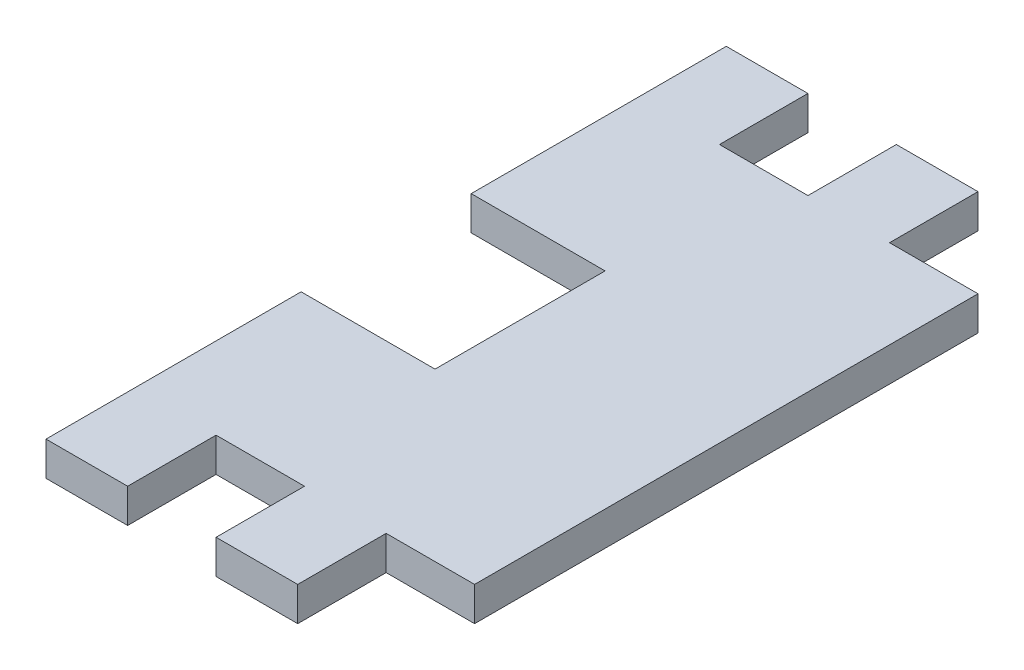
ISO-10303-21;
HEADER;
FILE_DESCRIPTION(('STEP AP214'),'2;1');
FILE_NAME('part.step','',(''),(''),'','','');
FILE_SCHEMA(('AUTOMOTIVE_DESIGN { 1 0 10303 214 1 1 1 1 }'));
ENDSEC;
DATA;
#1=APPLICATION_CONTEXT('core data for automotive mechanical design processes');
#2=APPLICATION_PROTOCOL_DEFINITION('international standard','automotive_design',2000,#1);
#3=PRODUCT_CONTEXT('',#1,'mechanical');
#4=PRODUCT('Part','Part','',(#3));
#5=PRODUCT_RELATED_PRODUCT_CATEGORY('part','',(#4));
#6=PRODUCT_DEFINITION_FORMATION('','',#4);
#7=PRODUCT_DEFINITION_CONTEXT('part definition',#1,'design');
#8=PRODUCT_DEFINITION('design','',#6,#7);
#9=PRODUCT_DEFINITION_SHAPE('','',#8);
#10=(LENGTH_UNIT() NAMED_UNIT(*) SI_UNIT(.MILLI.,.METRE.));
#11=(NAMED_UNIT(*) PLANE_ANGLE_UNIT() SI_UNIT($,.RADIAN.));
#12=(NAMED_UNIT(*) SI_UNIT($,.STERADIAN.) SOLID_ANGLE_UNIT());
#13=UNCERTAINTY_MEASURE_WITH_UNIT(LENGTH_MEASURE(1.E-05),#10,'distance_accuracy_value','');
#14=(GEOMETRIC_REPRESENTATION_CONTEXT(3) GLOBAL_UNCERTAINTY_ASSIGNED_CONTEXT((#13)) GLOBAL_UNIT_ASSIGNED_CONTEXT((#10,
#11,#12)) REPRESENTATION_CONTEXT('',''));
#15=CARTESIAN_POINT('',(0.,0.,0.));
#16=DIRECTION('',(0.,0.,1.));
#17=DIRECTION('',(1.,0.,0.));
#18=AXIS2_PLACEMENT_3D('',#15,#16,#17);
#19=CARTESIAN_POINT('',(0.,1.27,25.4));
#20=DIRECTION('',(0.,0.,-1.));
#21=DIRECTION('',(-1.,0.,0.));
#22=AXIS2_PLACEMENT_3D('',#19,#20,#21);
#23=PLANE('',#22);
#24=DIRECTION('',(1.,0.,0.));
#25=VECTOR('',#24,1.);
#26=CARTESIAN_POINT('',(0.,-1.27,25.4));
#27=LINE('',#26,#25);
#28=CARTESIAN_POINT('',(-25.4,-1.27,25.4));
#29=VERTEX_POINT('',#28);
#30=CARTESIAN_POINT('',(-19.304,-1.27,25.3999999999999));
#31=VERTEX_POINT('',#30);
#32=EDGE_CURVE('E234',#29,#31,#27,.T.);
#33=ORIENTED_EDGE('',*,*,#32,.T.);
#34=DIRECTION('',(0.,1.,0.));
#35=VECTOR('',#34,1.);
#36=CARTESIAN_POINT('',(-19.304,-1.27,25.3999999999999));
#37=LINE('',#36,#35);
#38=CARTESIAN_POINT('',(-19.304,1.27,25.3999999999999));
#39=VERTEX_POINT('',#38);
#40=EDGE_CURVE('E316',#31,#39,#37,.T.);
#41=ORIENTED_EDGE('',*,*,#40,.T.);
#42=DIRECTION('',(1.,0.,0.));
#43=VECTOR('',#42,1.);
#44=CARTESIAN_POINT('',(0.,1.27,25.4));
#45=LINE('',#44,#43);
#46=CARTESIAN_POINT('',(-25.4,1.27,25.4));
#47=VERTEX_POINT('',#46);
#48=EDGE_CURVE('E279',#47,#39,#45,.T.);
#49=ORIENTED_EDGE('',*,*,#48,.F.);
#50=DIRECTION('',(0.,-1.,0.));
#51=VECTOR('',#50,1.);
#52=CARTESIAN_POINT('',(-25.4,1.27,25.4));
#53=LINE('',#52,#51);
#54=EDGE_CURVE('E217',#47,#29,#53,.T.);
#55=ORIENTED_EDGE('',*,*,#54,.T.);
#56=EDGE_LOOP('',(#33,#41,#49,#55));
#57=FACE_BOUND('',#56,.T.);
#58=ADVANCED_FACE('F32',(#57),#23,.F.);
#59=CARTESIAN_POINT('',(0.,1.27,-25.4));
#60=DIRECTION('',(0.,0.,1.));
#61=DIRECTION('',(1.,0.,0.));
#62=AXIS2_PLACEMENT_3D('',#59,#60,#61);
#63=PLANE('',#62);
#64=DIRECTION('',(-1.,0.,0.));
#65=VECTOR('',#64,1.);
#66=CARTESIAN_POINT('',(0.,-1.27,-25.4));
#67=LINE('',#66,#65);
#68=CARTESIAN_POINT('',(-6.604,-1.27,-25.4));
#69=VERTEX_POINT('',#68);
#70=CARTESIAN_POINT('',(-12.7,-1.27,-25.3999999999999));
#71=VERTEX_POINT('',#70);
#72=EDGE_CURVE('E188',#69,#71,#67,.T.);
#73=ORIENTED_EDGE('',*,*,#72,.T.);
#74=DIRECTION('',(0.,1.,0.));
#75=VECTOR('',#74,1.);
#76=CARTESIAN_POINT('',(-12.7,-1.27,-25.3999999999999));
#77=LINE('',#76,#75);
#78=CARTESIAN_POINT('',(-12.7,1.27,-25.3999999999999));
#79=VERTEX_POINT('',#78);
#80=EDGE_CURVE('E169',#71,#79,#77,.T.);
#81=ORIENTED_EDGE('',*,*,#80,.T.);
#82=DIRECTION('',(-1.,0.,0.));
#83=VECTOR('',#82,1.);
#84=CARTESIAN_POINT('',(0.,1.27,-25.4));
#85=LINE('',#84,#83);
#86=CARTESIAN_POINT('',(-6.604,1.27,-25.4));
#87=VERTEX_POINT('',#86);
#88=EDGE_CURVE('E286',#87,#79,#85,.T.);
#89=ORIENTED_EDGE('',*,*,#88,.F.);
#90=DIRECTION('',(0.,1.,0.));
#91=VECTOR('',#90,1.);
#92=CARTESIAN_POINT('',(-6.604,-1.27,-25.4));
#93=LINE('',#92,#91);
#94=EDGE_CURVE('E195',#69,#87,#93,.T.);
#95=ORIENTED_EDGE('',*,*,#94,.F.);
#96=EDGE_LOOP('',(#73,#81,#89,#95));
#97=FACE_BOUND('',#96,.T.);
#98=ADVANCED_FACE('F194',(#97),#63,.F.);
#99=CARTESIAN_POINT('',(-15.4,1.27,-6.35));
#100=DIRECTION('',(1.,0.,0.));
#101=DIRECTION('',(0.,0.,-1.));
#102=AXIS2_PLACEMENT_3D('',#99,#100,#101);
#103=PLANE('',#102);
#104=DIRECTION('',(0.,0.,1.));
#105=VECTOR('',#104,1.);
#106=CARTESIAN_POINT('',(-15.4,-1.27,-6.35));
#107=LINE('',#106,#105);
#108=CARTESIAN_POINT('',(-15.4,-1.27,-6.35));
#109=VERTEX_POINT('',#108);
#110=CARTESIAN_POINT('',(-15.4,-1.27,6.35));
#111=VERTEX_POINT('',#110);
#112=EDGE_CURVE('E238',#109,#111,#107,.T.);
#113=ORIENTED_EDGE('',*,*,#112,.T.);
#114=DIRECTION('',(0.,-1.,0.));
#115=VECTOR('',#114,1.);
#116=CARTESIAN_POINT('',(-15.4,1.27,6.35));
#117=LINE('',#116,#115);
#118=CARTESIAN_POINT('',(-15.4,1.27,6.35));
#119=VERTEX_POINT('',#118);
#120=EDGE_CURVE('E11',#119,#111,#117,.T.);
#121=ORIENTED_EDGE('',*,*,#120,.F.);
#122=DIRECTION('',(0.,0.,1.));
#123=VECTOR('',#122,1.);
#124=CARTESIAN_POINT('',(-15.4,1.27,-6.35));
#125=LINE('',#124,#123);
#126=CARTESIAN_POINT('',(-15.4,1.27,-6.35));
#127=VERTEX_POINT('',#126);
#128=EDGE_CURVE('E206',#127,#119,#125,.T.);
#129=ORIENTED_EDGE('',*,*,#128,.F.);
#130=DIRECTION('',(0.,-1.,0.));
#131=VECTOR('',#130,1.);
#132=CARTESIAN_POINT('',(-15.4,1.27,-6.35));
#133=LINE('',#132,#131);
#134=EDGE_CURVE('E207',#127,#109,#133,.T.);
#135=ORIENTED_EDGE('',*,*,#134,.T.);
#136=EDGE_LOOP('',(#113,#121,#129,#135));
#137=FACE_BOUND('',#136,.T.);
#138=ADVANCED_FACE('F34',(#137),#103,.F.);
#139=CARTESIAN_POINT('',(-25.4,1.27,6.35));
#140=DIRECTION('',(0.,0.,1.));
#141=DIRECTION('',(1.,0.,0.));
#142=AXIS2_PLACEMENT_3D('',#139,#140,#141);
#143=PLANE('',#142);
#144=DIRECTION('',(-1.,0.,0.));
#145=VECTOR('',#144,1.);
#146=CARTESIAN_POINT('',(-25.4,-1.27,6.35));
#147=LINE('',#146,#145);
#148=CARTESIAN_POINT('',(-25.4,-1.27,6.35));
#149=VERTEX_POINT('',#148);
#150=EDGE_CURVE('E231',#111,#149,#147,.T.);
#151=ORIENTED_EDGE('',*,*,#150,.T.);
#152=DIRECTION('',(0.,-1.,0.));
#153=VECTOR('',#152,1.);
#154=CARTESIAN_POINT('',(-25.4,1.27,6.35));
#155=LINE('',#154,#153);
#156=CARTESIAN_POINT('',(-25.4,1.27,6.35));
#157=VERTEX_POINT('',#156);
#158=EDGE_CURVE('E40',#157,#149,#155,.T.);
#159=ORIENTED_EDGE('',*,*,#158,.F.);
#160=DIRECTION('',(-1.,0.,0.));
#161=VECTOR('',#160,1.);
#162=CARTESIAN_POINT('',(-25.4,1.27,6.35));
#163=LINE('',#162,#161);
#164=EDGE_CURVE('E275',#119,#157,#163,.T.);
#165=ORIENTED_EDGE('',*,*,#164,.F.);
#166=ORIENTED_EDGE('',*,*,#120,.T.);
#167=EDGE_LOOP('',(#151,#159,#165,#166));
#168=FACE_BOUND('',#167,.T.);
#169=ADVANCED_FACE('F394',(#168),#143,.F.);
#170=CARTESIAN_POINT('',(-25.4,1.27,25.4));
#171=DIRECTION('',(1.,0.,0.));
#172=DIRECTION('',(0.,0.,-1.));
#173=AXIS2_PLACEMENT_3D('',#170,#171,#172);
#174=PLANE('',#173);
#175=DIRECTION('',(0.,0.,1.));
#176=VECTOR('',#175,1.);
#177=CARTESIAN_POINT('',(-25.4,-1.27,25.4));
#178=LINE('',#177,#176);
#179=EDGE_CURVE('E226',#149,#29,#178,.T.);
#180=ORIENTED_EDGE('',*,*,#179,.T.);
#181=ORIENTED_EDGE('',*,*,#54,.F.);
#182=DIRECTION('',(0.,0.,1.));
#183=VECTOR('',#182,1.);
#184=CARTESIAN_POINT('',(-25.4,1.27,25.4));
#185=LINE('',#184,#183);
#186=EDGE_CURVE('E227',#157,#47,#185,.T.);
#187=ORIENTED_EDGE('',*,*,#186,.F.);
#188=ORIENTED_EDGE('',*,*,#158,.T.);
#189=EDGE_LOOP('',(#180,#181,#187,#188));
#190=FACE_BOUND('',#189,.T.);
#191=ADVANCED_FACE('F224',(#190),#174,.F.);
#192=CARTESIAN_POINT('',(-12.7,-1.27,25.3999999999999));
#193=VERTEX_POINT('',#192);
#194=CARTESIAN_POINT('',(-6.60400000000001,-1.27,25.4));
#195=VERTEX_POINT('',#194);
#196=EDGE_CURVE('E235',#193,#195,#27,.T.);
#197=ORIENTED_EDGE('',*,*,#196,.T.);
#198=DIRECTION('',(0.,1.,0.));
#199=VECTOR('',#198,1.);
#200=CARTESIAN_POINT('',(-6.60400000000001,-1.27,25.4));
#201=LINE('',#200,#199);
#202=CARTESIAN_POINT('',(-6.60400000000001,1.27,25.4));
#203=VERTEX_POINT('',#202);
#204=EDGE_CURVE('E337',#195,#203,#201,.T.);
#205=ORIENTED_EDGE('',*,*,#204,.T.);
#206=CARTESIAN_POINT('',(-12.7,1.27,25.3999999999999));
#207=VERTEX_POINT('',#206);
#208=EDGE_CURVE('E278',#207,#203,#45,.T.);
#209=ORIENTED_EDGE('',*,*,#208,.F.);
#210=DIRECTION('',(0.,1.,0.));
#211=VECTOR('',#210,1.);
#212=CARTESIAN_POINT('',(-12.7,-1.27,25.3999999999999));
#213=LINE('',#212,#211);
#214=EDGE_CURVE('E332',#193,#207,#213,.T.);
#215=ORIENTED_EDGE('',*,*,#214,.F.);
#216=EDGE_LOOP('',(#197,#205,#209,#215));
#217=FACE_BOUND('',#216,.T.);
#218=ADVANCED_FACE('F369',(#217),#23,.F.);
#219=CARTESIAN_POINT('',(0.,1.27,25.4));
#220=DIRECTION('',(-1.,0.,0.));
#221=DIRECTION('',(0.,0.,1.));
#222=AXIS2_PLACEMENT_3D('',#219,#220,#221);
#223=PLANE('',#222);
#224=DIRECTION('',(0.,0.,-1.));
#225=VECTOR('',#224,1.);
#226=CARTESIAN_POINT('',(0.,1.27,25.4));
#227=LINE('',#226,#225);
#228=CARTESIAN_POINT('',(0.,1.27,18.796));
#229=VERTEX_POINT('',#228);
#230=CARTESIAN_POINT('',(0.,1.27,-18.796));
#231=VERTEX_POINT('',#230);
#232=EDGE_CURVE('E282',#229,#231,#227,.T.);
#233=ORIENTED_EDGE('',*,*,#232,.F.);
#234=DIRECTION('',(0.,1.,0.));
#235=VECTOR('',#234,1.);
#236=CARTESIAN_POINT('',(0.,-1.27,18.796));
#237=LINE('',#236,#235);
#238=CARTESIAN_POINT('',(0.,-1.27,18.796));
#239=VERTEX_POINT('',#238);
#240=EDGE_CURVE('E252',#239,#229,#237,.T.);
#241=ORIENTED_EDGE('',*,*,#240,.F.);
#242=DIRECTION('',(0.,0.,-1.));
#243=VECTOR('',#242,1.);
#244=CARTESIAN_POINT('',(0.,-1.27,25.4));
#245=LINE('',#244,#243);
#246=CARTESIAN_POINT('',(0.,-1.27,-18.796));
#247=VERTEX_POINT('',#246);
#248=EDGE_CURVE('E201',#239,#247,#245,.T.);
#249=ORIENTED_EDGE('',*,*,#248,.T.);
#250=DIRECTION('',(0.,1.,0.));
#251=VECTOR('',#250,1.);
#252=CARTESIAN_POINT('',(0.,-1.27,-18.796));
#253=LINE('',#252,#251);
#254=EDGE_CURVE('E250',#247,#231,#253,.T.);
#255=ORIENTED_EDGE('',*,*,#254,.T.);
#256=EDGE_LOOP('',(#233,#241,#249,#255));
#257=FACE_BOUND('',#256,.T.);
#258=ADVANCED_FACE('F249',(#257),#223,.F.);
#259=CARTESIAN_POINT('',(-19.304,1.27,-25.3999999999999));
#260=VERTEX_POINT('',#259);
#261=CARTESIAN_POINT('',(-25.4,1.27,-25.4));
#262=VERTEX_POINT('',#261);
#263=EDGE_CURVE('E284',#260,#262,#85,.T.);
#264=ORIENTED_EDGE('',*,*,#263,.F.);
#265=DIRECTION('',(0.,1.,0.));
#266=VECTOR('',#265,1.);
#267=CARTESIAN_POINT('',(-19.304,-1.27,-25.3999999999999));
#268=LINE('',#267,#266);
#269=CARTESIAN_POINT('',(-19.304,-1.27,-25.3999999999999));
#270=VERTEX_POINT('',#269);
#271=EDGE_CURVE('E180',#270,#260,#268,.T.);
#272=ORIENTED_EDGE('',*,*,#271,.F.);
#273=CARTESIAN_POINT('',(-25.4,-1.27,-25.4));
#274=VERTEX_POINT('',#273);
#275=EDGE_CURVE('E197',#270,#274,#67,.T.);
#276=ORIENTED_EDGE('',*,*,#275,.T.);
#277=DIRECTION('',(0.,-1.,0.));
#278=VECTOR('',#277,1.);
#279=CARTESIAN_POINT('',(-25.4,1.27,-25.4));
#280=LINE('',#279,#278);
#281=EDGE_CURVE('E214',#262,#274,#280,.T.);
#282=ORIENTED_EDGE('',*,*,#281,.F.);
#283=EDGE_LOOP('',(#264,#272,#276,#282));
#284=FACE_BOUND('',#283,.T.);
#285=ADVANCED_FACE('F307',(#284),#63,.F.);
#286=CARTESIAN_POINT('',(-25.4,1.27,-25.4));
#287=DIRECTION('',(1.,0.,0.));
#288=DIRECTION('',(0.,0.,-1.));
#289=AXIS2_PLACEMENT_3D('',#286,#287,#288);
#290=PLANE('',#289);
#291=DIRECTION('',(0.,0.,1.));
#292=VECTOR('',#291,1.);
#293=CARTESIAN_POINT('',(-25.4,-1.27,-25.4));
#294=LINE('',#293,#292);
#295=CARTESIAN_POINT('',(-25.4,-1.27,-6.34999999999999));
#296=VERTEX_POINT('',#295);
#297=EDGE_CURVE('E196',#274,#296,#294,.T.);
#298=ORIENTED_EDGE('',*,*,#297,.T.);
#299=DIRECTION('',(0.,-1.,0.));
#300=VECTOR('',#299,1.);
#301=CARTESIAN_POINT('',(-25.4,1.27,-6.34999999999999));
#302=LINE('',#301,#300);
#303=CARTESIAN_POINT('',(-25.4,1.27,-6.34999999999999));
#304=VERTEX_POINT('',#303);
#305=EDGE_CURVE('E210',#304,#296,#302,.T.);
#306=ORIENTED_EDGE('',*,*,#305,.F.);
#307=DIRECTION('',(0.,0.,1.));
#308=VECTOR('',#307,1.);
#309=CARTESIAN_POINT('',(-25.4,1.27,-25.4));
#310=LINE('',#309,#308);
#311=EDGE_CURVE('E287',#262,#304,#310,.T.);
#312=ORIENTED_EDGE('',*,*,#311,.F.);
#313=ORIENTED_EDGE('',*,*,#281,.T.);
#314=EDGE_LOOP('',(#298,#306,#312,#313));
#315=FACE_BOUND('',#314,.T.);
#316=ADVANCED_FACE('F303',(#315),#290,.F.);
#317=CARTESIAN_POINT('',(-25.4,1.27,-6.34999999999999));
#318=DIRECTION('',(0.,0.,-1.));
#319=DIRECTION('',(-1.,0.,0.));
#320=AXIS2_PLACEMENT_3D('',#317,#318,#319);
#321=PLANE('',#320);
#322=DIRECTION('',(1.,0.,0.));
#323=VECTOR('',#322,1.);
#324=CARTESIAN_POINT('',(-25.4,-1.27,-6.34999999999999));
#325=LINE('',#324,#323);
#326=EDGE_CURVE('E199',#296,#109,#325,.T.);
#327=ORIENTED_EDGE('',*,*,#326,.T.);
#328=ORIENTED_EDGE('',*,*,#134,.F.);
#329=DIRECTION('',(1.,0.,0.));
#330=VECTOR('',#329,1.);
#331=CARTESIAN_POINT('',(-25.4,1.27,-6.34999999999999));
#332=LINE('',#331,#330);
#333=EDGE_CURVE('E211',#304,#127,#332,.T.);
#334=ORIENTED_EDGE('',*,*,#333,.F.);
#335=ORIENTED_EDGE('',*,*,#305,.T.);
#336=EDGE_LOOP('',(#327,#328,#334,#335));
#337=FACE_BOUND('',#336,.T.);
#338=ADVANCED_FACE('F298',(#337),#321,.F.);
#339=CARTESIAN_POINT('',(0.,1.27,0.));
#340=DIRECTION('',(0.,1.,0.));
#341=DIRECTION('',(0.,0.,1.));
#342=AXIS2_PLACEMENT_3D('',#339,#340,#341);
#343=PLANE('',#342);
#344=DIRECTION('',(0.,0.,1.));
#345=VECTOR('',#344,1.);
#346=CARTESIAN_POINT('',(-6.60400000000001,1.27,25.4));
#347=LINE('',#346,#345);
#348=CARTESIAN_POINT('',(-6.604,1.27,18.796));
#349=VERTEX_POINT('',#348);
#350=EDGE_CURVE('E348',#349,#203,#347,.T.);
#351=ORIENTED_EDGE('',*,*,#350,.F.);
#352=DIRECTION('',(-1.,0.,0.));
#353=VECTOR('',#352,1.);
#354=CARTESIAN_POINT('',(0.,1.27,18.796));
#355=LINE('',#354,#353);
#356=EDGE_CURVE('E350',#229,#349,#355,.T.);
#357=ORIENTED_EDGE('',*,*,#356,.F.);
#358=ORIENTED_EDGE('',*,*,#232,.T.);
#359=DIRECTION('',(1.,0.,0.));
#360=VECTOR('',#359,1.);
#361=CARTESIAN_POINT('',(0.,1.27,-18.796));
#362=LINE('',#361,#360);
#363=CARTESIAN_POINT('',(-6.604,1.27,-18.796));
#364=VERTEX_POINT('',#363);
#365=EDGE_CURVE('E262',#364,#231,#362,.T.);
#366=ORIENTED_EDGE('',*,*,#365,.F.);
#367=DIRECTION('',(0.,0.,1.));
#368=VECTOR('',#367,1.);
#369=CARTESIAN_POINT('',(-6.604,1.27,-25.4));
#370=LINE('',#369,#368);
#371=EDGE_CURVE('E266',#87,#364,#370,.T.);
#372=ORIENTED_EDGE('',*,*,#371,.F.);
#373=ORIENTED_EDGE('',*,*,#88,.T.);
#374=DIRECTION('',(0.,0.,-1.));
#375=VECTOR('',#374,1.);
#376=CARTESIAN_POINT('',(-12.7,1.27,-25.3999999999999));
#377=LINE('',#376,#375);
#378=CARTESIAN_POINT('',(-12.7,1.27,-18.7959999999999));
#379=VERTEX_POINT('',#378);
#380=EDGE_CURVE('E175',#379,#79,#377,.T.);
#381=ORIENTED_EDGE('',*,*,#380,.F.);
#382=DIRECTION('',(1.,0.,0.));
#383=VECTOR('',#382,1.);
#384=CARTESIAN_POINT('',(-12.7,1.27,-18.7959999999999));
#385=LINE('',#384,#383);
#386=CARTESIAN_POINT('',(-19.304,1.27,-18.7959999999999));
#387=VERTEX_POINT('',#386);
#388=EDGE_CURVE('E191',#387,#379,#385,.T.);
#389=ORIENTED_EDGE('',*,*,#388,.F.);
#390=DIRECTION('',(0.,0.,1.));
#391=VECTOR('',#390,1.);
#392=CARTESIAN_POINT('',(-19.304,1.27,-25.3999999999999));
#393=LINE('',#392,#391);
#394=EDGE_CURVE('E315',#260,#387,#393,.T.);
#395=ORIENTED_EDGE('',*,*,#394,.F.);
#396=ORIENTED_EDGE('',*,*,#263,.T.);
#397=ORIENTED_EDGE('',*,*,#311,.T.);
#398=ORIENTED_EDGE('',*,*,#333,.T.);
#399=ORIENTED_EDGE('',*,*,#128,.T.);
#400=ORIENTED_EDGE('',*,*,#164,.T.);
#401=ORIENTED_EDGE('',*,*,#186,.T.);
#402=ORIENTED_EDGE('',*,*,#48,.T.);
#403=DIRECTION('',(0.,0.,1.));
#404=VECTOR('',#403,1.);
#405=CARTESIAN_POINT('',(-19.304,1.27,25.3999999999999));
#406=LINE('',#405,#404);
#407=CARTESIAN_POINT('',(-19.304,1.27,18.7959999999999));
#408=VERTEX_POINT('',#407);
#409=EDGE_CURVE('E328',#408,#39,#406,.T.);
#410=ORIENTED_EDGE('',*,*,#409,.F.);
#411=DIRECTION('',(-1.,0.,0.));
#412=VECTOR('',#411,1.);
#413=CARTESIAN_POINT('',(-12.7,1.27,18.7959999999999));
#414=LINE('',#413,#412);
#415=CARTESIAN_POINT('',(-12.7,1.27,18.7959999999999));
#416=VERTEX_POINT('',#415);
#417=EDGE_CURVE('E336',#416,#408,#414,.T.);
#418=ORIENTED_EDGE('',*,*,#417,.F.);
#419=DIRECTION('',(0.,0.,-1.));
#420=VECTOR('',#419,1.);
#421=CARTESIAN_POINT('',(-12.7,1.27,25.3999999999999));
#422=LINE('',#421,#420);
#423=EDGE_CURVE('E333',#207,#416,#422,.T.);
#424=ORIENTED_EDGE('',*,*,#423,.F.);
#425=ORIENTED_EDGE('',*,*,#208,.T.);
#426=EDGE_LOOP('',(#351,#357,#358,#366,#372,#373,#381,#389,#395,#396,#397,#398,#399,#400,#401,
#402,#410,#418,#424,#425));
#427=FACE_BOUND('',#426,.T.);
#428=ADVANCED_FACE('F362',(#427),#343,.T.);
#429=CARTESIAN_POINT('',(0.,-1.27,0.));
#430=DIRECTION('',(0.,1.,0.));
#431=DIRECTION('',(0.,0.,1.));
#432=AXIS2_PLACEMENT_3D('',#429,#430,#431);
#433=PLANE('',#432);
#434=DIRECTION('',(-1.,0.,0.));
#435=VECTOR('',#434,1.);
#436=CARTESIAN_POINT('',(0.,-1.27,18.796));
#437=LINE('',#436,#435);
#438=CARTESIAN_POINT('',(-6.604,-1.27,18.796));
#439=VERTEX_POINT('',#438);
#440=EDGE_CURVE('E254',#239,#439,#437,.T.);
#441=ORIENTED_EDGE('',*,*,#440,.T.);
#442=DIRECTION('',(0.,0.,1.));
#443=VECTOR('',#442,1.);
#444=CARTESIAN_POINT('',(-6.60400000000001,-1.27,25.4));
#445=LINE('',#444,#443);
#446=EDGE_CURVE('E47',#439,#195,#445,.T.);
#447=ORIENTED_EDGE('',*,*,#446,.T.);
#448=ORIENTED_EDGE('',*,*,#196,.F.);
#449=DIRECTION('',(0.,0.,-1.));
#450=VECTOR('',#449,1.);
#451=CARTESIAN_POINT('',(-12.7,-1.27,25.3999999999999));
#452=LINE('',#451,#450);
#453=CARTESIAN_POINT('',(-12.7,-1.27,18.7959999999999));
#454=VERTEX_POINT('',#453);
#455=EDGE_CURVE('E325',#193,#454,#452,.T.);
#456=ORIENTED_EDGE('',*,*,#455,.T.);
#457=DIRECTION('',(-1.,0.,0.));
#458=VECTOR('',#457,1.);
#459=CARTESIAN_POINT('',(-12.7,-1.27,18.7959999999999));
#460=LINE('',#459,#458);
#461=CARTESIAN_POINT('',(-19.304,-1.27,18.7959999999999));
#462=VERTEX_POINT('',#461);
#463=EDGE_CURVE('E55',#454,#462,#460,.T.);
#464=ORIENTED_EDGE('',*,*,#463,.T.);
#465=DIRECTION('',(0.,0.,1.));
#466=VECTOR('',#465,1.);
#467=CARTESIAN_POINT('',(-19.304,-1.27,25.3999999999999));
#468=LINE('',#467,#466);
#469=EDGE_CURVE('E330',#462,#31,#468,.T.);
#470=ORIENTED_EDGE('',*,*,#469,.T.);
#471=ORIENTED_EDGE('',*,*,#32,.F.);
#472=ORIENTED_EDGE('',*,*,#179,.F.);
#473=ORIENTED_EDGE('',*,*,#150,.F.);
#474=ORIENTED_EDGE('',*,*,#112,.F.);
#475=ORIENTED_EDGE('',*,*,#326,.F.);
#476=ORIENTED_EDGE('',*,*,#297,.F.);
#477=ORIENTED_EDGE('',*,*,#275,.F.);
#478=DIRECTION('',(0.,0.,1.));
#479=VECTOR('',#478,1.);
#480=CARTESIAN_POINT('',(-19.304,-1.27,-25.3999999999999));
#481=LINE('',#480,#479);
#482=CARTESIAN_POINT('',(-19.304,-1.27,-18.7959999999999));
#483=VERTEX_POINT('',#482);
#484=EDGE_CURVE('E190',#270,#483,#481,.T.);
#485=ORIENTED_EDGE('',*,*,#484,.T.);
#486=DIRECTION('',(1.,0.,0.));
#487=VECTOR('',#486,1.);
#488=CARTESIAN_POINT('',(-12.7,-1.27,-18.7959999999999));
#489=LINE('',#488,#487);
#490=CARTESIAN_POINT('',(-12.7,-1.27,-18.7959999999999));
#491=VERTEX_POINT('',#490);
#492=EDGE_CURVE('E181',#483,#491,#489,.T.);
#493=ORIENTED_EDGE('',*,*,#492,.T.);
#494=DIRECTION('',(0.,0.,-1.));
#495=VECTOR('',#494,1.);
#496=CARTESIAN_POINT('',(-12.7,-1.27,-25.3999999999999));
#497=LINE('',#496,#495);
#498=EDGE_CURVE('E172',#491,#71,#497,.T.);
#499=ORIENTED_EDGE('',*,*,#498,.T.);
#500=ORIENTED_EDGE('',*,*,#72,.F.);
#501=DIRECTION('',(0.,0.,1.));
#502=VECTOR('',#501,1.);
#503=CARTESIAN_POINT('',(-6.604,-1.27,-25.4));
#504=LINE('',#503,#502);
#505=CARTESIAN_POINT('',(-6.604,-1.27,-18.796));
#506=VERTEX_POINT('',#505);
#507=EDGE_CURVE('E256',#69,#506,#504,.T.);
#508=ORIENTED_EDGE('',*,*,#507,.T.);
#509=DIRECTION('',(1.,0.,0.));
#510=VECTOR('',#509,1.);
#511=CARTESIAN_POINT('',(0.,-1.27,-18.796));
#512=LINE('',#511,#510);
#513=EDGE_CURVE('E255',#506,#247,#512,.T.);
#514=ORIENTED_EDGE('',*,*,#513,.T.);
#515=ORIENTED_EDGE('',*,*,#248,.F.);
#516=EDGE_LOOP('',(#441,#447,#448,#456,#464,#470,#471,#472,#473,#474,#475,#476,#477,#485,#493,
#499,#500,#508,#514,#515));
#517=FACE_BOUND('',#516,.T.);
#518=ADVANCED_FACE('F186',(#517),#433,.F.);
#519=CARTESIAN_POINT('',(0.,-1.27,-18.796));
#520=DIRECTION('',(0.,0.,1.));
#521=DIRECTION('',(1.,0.,0.));
#522=AXIS2_PLACEMENT_3D('',#519,#520,#521);
#523=PLANE('',#522);
#524=ORIENTED_EDGE('',*,*,#365,.T.);
#525=ORIENTED_EDGE('',*,*,#254,.F.);
#526=ORIENTED_EDGE('',*,*,#513,.F.);
#527=DIRECTION('',(0.,1.,0.));
#528=VECTOR('',#527,1.);
#529=CARTESIAN_POINT('',(-6.604,-1.27,-18.796));
#530=LINE('',#529,#528);
#531=EDGE_CURVE('E260',#506,#364,#530,.T.);
#532=ORIENTED_EDGE('',*,*,#531,.T.);
#533=EDGE_LOOP('',(#524,#525,#526,#532));
#534=FACE_BOUND('',#533,.T.);
#535=ADVANCED_FACE('F409',(#534),#523,.F.);
#536=CARTESIAN_POINT('',(-6.604,-1.27,-25.4));
#537=DIRECTION('',(-1.,0.,0.));
#538=DIRECTION('',(0.,0.,1.));
#539=AXIS2_PLACEMENT_3D('',#536,#537,#538);
#540=PLANE('',#539);
#541=ORIENTED_EDGE('',*,*,#371,.T.);
#542=ORIENTED_EDGE('',*,*,#531,.F.);
#543=ORIENTED_EDGE('',*,*,#507,.F.);
#544=ORIENTED_EDGE('',*,*,#94,.T.);
#545=EDGE_LOOP('',(#541,#542,#543,#544));
#546=FACE_BOUND('',#545,.T.);
#547=ADVANCED_FACE('F408',(#546),#540,.F.);
#548=CARTESIAN_POINT('',(-12.7,-1.27,-25.3999999999999));
#549=DIRECTION('',(1.,0.,0.));
#550=DIRECTION('',(0.,0.,-1.));
#551=AXIS2_PLACEMENT_3D('',#548,#549,#550);
#552=PLANE('',#551);
#553=ORIENTED_EDGE('',*,*,#380,.T.);
#554=ORIENTED_EDGE('',*,*,#80,.F.);
#555=ORIENTED_EDGE('',*,*,#498,.F.);
#556=DIRECTION('',(0.,1.,0.));
#557=VECTOR('',#556,1.);
#558=CARTESIAN_POINT('',(-12.7,-1.27,-18.7959999999999));
#559=LINE('',#558,#557);
#560=EDGE_CURVE('E269',#491,#379,#559,.T.);
#561=ORIENTED_EDGE('',*,*,#560,.T.);
#562=EDGE_LOOP('',(#553,#554,#555,#561));
#563=FACE_BOUND('',#562,.T.);
#564=ADVANCED_FACE('F171',(#563),#552,.F.);
#565=CARTESIAN_POINT('',(-12.7,-1.27,-18.7959999999999));
#566=DIRECTION('',(0.,0.,1.));
#567=DIRECTION('',(1.,0.,0.));
#568=AXIS2_PLACEMENT_3D('',#565,#566,#567);
#569=PLANE('',#568);
#570=ORIENTED_EDGE('',*,*,#388,.T.);
#571=ORIENTED_EDGE('',*,*,#560,.F.);
#572=ORIENTED_EDGE('',*,*,#492,.F.);
#573=DIRECTION('',(0.,1.,0.));
#574=VECTOR('',#573,1.);
#575=CARTESIAN_POINT('',(-19.304,-1.27,-18.7959999999999));
#576=LINE('',#575,#574);
#577=EDGE_CURVE('E322',#483,#387,#576,.T.);
#578=ORIENTED_EDGE('',*,*,#577,.T.);
#579=EDGE_LOOP('',(#570,#571,#572,#578));
#580=FACE_BOUND('',#579,.T.);
#581=ADVANCED_FACE('F405',(#580),#569,.F.);
#582=CARTESIAN_POINT('',(-19.304,-1.27,-25.3999999999999));
#583=DIRECTION('',(-1.,0.,0.));
#584=DIRECTION('',(0.,0.,1.));
#585=AXIS2_PLACEMENT_3D('',#582,#583,#584);
#586=PLANE('',#585);
#587=ORIENTED_EDGE('',*,*,#394,.T.);
#588=ORIENTED_EDGE('',*,*,#577,.F.);
#589=ORIENTED_EDGE('',*,*,#484,.F.);
#590=ORIENTED_EDGE('',*,*,#271,.T.);
#591=EDGE_LOOP('',(#587,#588,#589,#590));
#592=FACE_BOUND('',#591,.T.);
#593=ADVANCED_FACE('F403',(#592),#586,.F.);
#594=CARTESIAN_POINT('',(-19.304,-1.27,25.3999999999999));
#595=DIRECTION('',(-1.,0.,0.));
#596=DIRECTION('',(0.,0.,1.));
#597=AXIS2_PLACEMENT_3D('',#594,#595,#596);
#598=PLANE('',#597);
#599=ORIENTED_EDGE('',*,*,#409,.T.);
#600=ORIENTED_EDGE('',*,*,#40,.F.);
#601=ORIENTED_EDGE('',*,*,#469,.F.);
#602=DIRECTION('',(0.,1.,0.));
#603=VECTOR('',#602,1.);
#604=CARTESIAN_POINT('',(-19.304,-1.27,18.7959999999999));
#605=LINE('',#604,#603);
#606=EDGE_CURVE('E342',#462,#408,#605,.T.);
#607=ORIENTED_EDGE('',*,*,#606,.T.);
#608=EDGE_LOOP('',(#599,#600,#601,#607));
#609=FACE_BOUND('',#608,.T.);
#610=ADVANCED_FACE('F380',(#609),#598,.F.);
#611=CARTESIAN_POINT('',(-12.7,-1.27,18.7959999999999));
#612=DIRECTION('',(0.,0.,-1.));
#613=DIRECTION('',(-1.,0.,0.));
#614=AXIS2_PLACEMENT_3D('',#611,#612,#613);
#615=PLANE('',#614);
#616=ORIENTED_EDGE('',*,*,#417,.T.);
#617=ORIENTED_EDGE('',*,*,#606,.F.);
#618=ORIENTED_EDGE('',*,*,#463,.F.);
#619=DIRECTION('',(0.,1.,0.));
#620=VECTOR('',#619,1.);
#621=CARTESIAN_POINT('',(-12.7,-1.27,18.7959999999999));
#622=LINE('',#621,#620);
#623=EDGE_CURVE('E344',#454,#416,#622,.T.);
#624=ORIENTED_EDGE('',*,*,#623,.T.);
#625=EDGE_LOOP('',(#616,#617,#618,#624));
#626=FACE_BOUND('',#625,.T.);
#627=ADVANCED_FACE('F375',(#626),#615,.F.);
#628=CARTESIAN_POINT('',(-12.7,-1.27,25.3999999999999));
#629=DIRECTION('',(1.,0.,0.));
#630=DIRECTION('',(0.,0.,-1.));
#631=AXIS2_PLACEMENT_3D('',#628,#629,#630);
#632=PLANE('',#631);
#633=ORIENTED_EDGE('',*,*,#423,.T.);
#634=ORIENTED_EDGE('',*,*,#623,.F.);
#635=ORIENTED_EDGE('',*,*,#455,.F.);
#636=ORIENTED_EDGE('',*,*,#214,.T.);
#637=EDGE_LOOP('',(#633,#634,#635,#636));
#638=FACE_BOUND('',#637,.T.);
#639=ADVANCED_FACE('F373',(#638),#632,.F.);
#640=CARTESIAN_POINT('',(-6.60400000000001,-1.27,25.4));
#641=DIRECTION('',(-1.,0.,0.));
#642=DIRECTION('',(0.,0.,1.));
#643=AXIS2_PLACEMENT_3D('',#640,#641,#642);
#644=PLANE('',#643);
#645=ORIENTED_EDGE('',*,*,#350,.T.);
#646=ORIENTED_EDGE('',*,*,#204,.F.);
#647=ORIENTED_EDGE('',*,*,#446,.F.);
#648=DIRECTION('',(0.,1.,0.));
#649=VECTOR('',#648,1.);
#650=CARTESIAN_POINT('',(-6.604,-1.27,18.796));
#651=LINE('',#650,#649);
#652=EDGE_CURVE('E356',#439,#349,#651,.T.);
#653=ORIENTED_EDGE('',*,*,#652,.T.);
#654=EDGE_LOOP('',(#645,#646,#647,#653));
#655=FACE_BOUND('',#654,.T.);
#656=ADVANCED_FACE('F367',(#655),#644,.F.);
#657=CARTESIAN_POINT('',(0.,-1.27,18.796));
#658=DIRECTION('',(0.,0.,-1.));
#659=DIRECTION('',(-1.,0.,0.));
#660=AXIS2_PLACEMENT_3D('',#657,#658,#659);
#661=PLANE('',#660);
#662=ORIENTED_EDGE('',*,*,#356,.T.);
#663=ORIENTED_EDGE('',*,*,#652,.F.);
#664=ORIENTED_EDGE('',*,*,#440,.F.);
#665=ORIENTED_EDGE('',*,*,#240,.T.);
#666=EDGE_LOOP('',(#662,#663,#664,#665));
#667=FACE_BOUND('',#666,.T.);
#668=ADVANCED_FACE('F359',(#667),#661,.F.);
#669=CLOSED_SHELL('',(#58,#98,#138,#169,#191,#218,#258,#285,#316,#338,#428,#518,#535,#547,#564,
#581,#593,#610,#627,#639,#656,#668));
#670=MANIFOLD_SOLID_BREP('B2',#669);
#671=ADVANCED_BREP_SHAPE_REPRESENTATION('',(#18,#670),#14);
#672=SHAPE_DEFINITION_REPRESENTATION(#9,#671);
ENDSEC;
END-ISO-10303-21;
